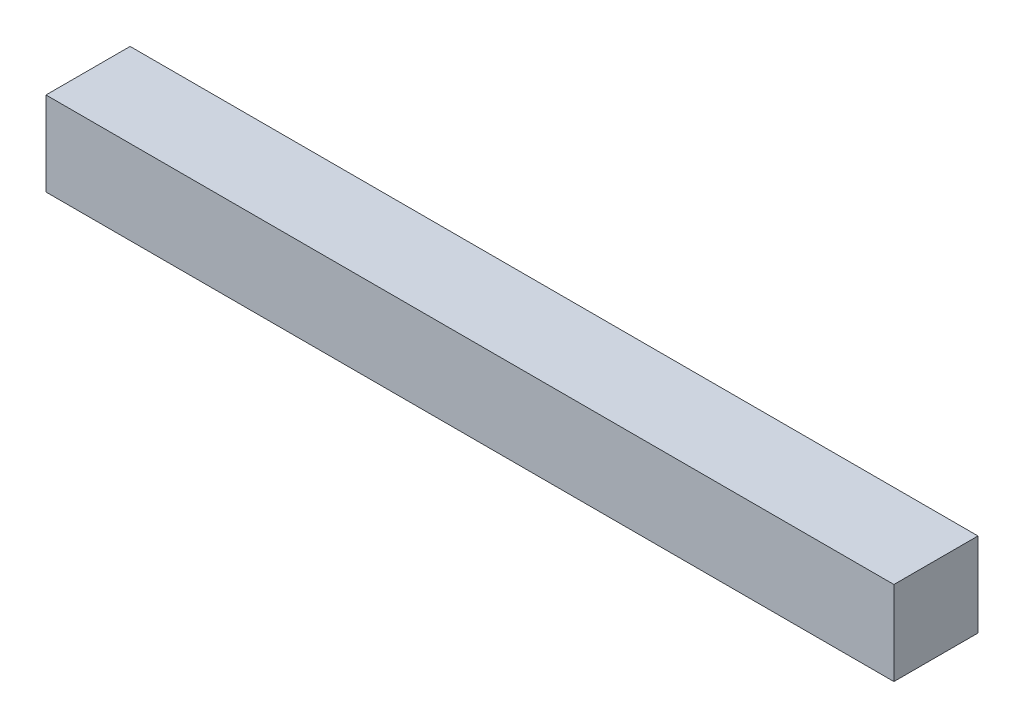
ISO-10303-21;
HEADER;
FILE_DESCRIPTION(('STEP AP214'),'2;1');
FILE_NAME('part.step','',(''),(''),'','','');
FILE_SCHEMA(('AUTOMOTIVE_DESIGN { 1 0 10303 214 1 1 1 1 }'));
ENDSEC;
DATA;
#1=APPLICATION_CONTEXT('core data for automotive mechanical design processes');
#2=APPLICATION_PROTOCOL_DEFINITION('international standard','automotive_design',2000,#1);
#3=PRODUCT_CONTEXT('',#1,'mechanical');
#4=PRODUCT('Part','Part','',(#3));
#5=PRODUCT_RELATED_PRODUCT_CATEGORY('part','',(#4));
#6=PRODUCT_DEFINITION_FORMATION('','',#4);
#7=PRODUCT_DEFINITION_CONTEXT('part definition',#1,'design');
#8=PRODUCT_DEFINITION('design','',#6,#7);
#9=PRODUCT_DEFINITION_SHAPE('','',#8);
#10=(LENGTH_UNIT() NAMED_UNIT(*) SI_UNIT(.MILLI.,.METRE.));
#11=(NAMED_UNIT(*) PLANE_ANGLE_UNIT() SI_UNIT($,.RADIAN.));
#12=(NAMED_UNIT(*) SI_UNIT($,.STERADIAN.) SOLID_ANGLE_UNIT());
#13=UNCERTAINTY_MEASURE_WITH_UNIT(LENGTH_MEASURE(1.E-05),#10,'distance_accuracy_value','');
#14=(GEOMETRIC_REPRESENTATION_CONTEXT(3) GLOBAL_UNCERTAINTY_ASSIGNED_CONTEXT((#13)) GLOBAL_UNIT_ASSIGNED_CONTEXT((#10,
#11,#12)) REPRESENTATION_CONTEXT('',''));
#15=CARTESIAN_POINT('',(0.,0.,0.));
#16=DIRECTION('',(0.,0.,1.));
#17=DIRECTION('',(1.,0.,0.));
#18=AXIS2_PLACEMENT_3D('',#15,#16,#17);
#19=CARTESIAN_POINT('',(-1.,0.4,0.4));
#20=DIRECTION('',(0.,0.,-1.));
#21=DIRECTION('',(0.,1.,0.));
#22=AXIS2_PLACEMENT_3D('',#19,#20,#21);
#23=PLANE('',#22);
#24=DIRECTION('',(0.,-1.,0.));
#25=VECTOR('',#24,1.);
#26=CARTESIAN_POINT('',(-1.033742545802,0.4,0.4));
#27=LINE('',#26,#25);
#28=CARTESIAN_POINT('',(-1.033742545802,0.4,0.4));
#29=VERTEX_POINT('',#28);
#30=CARTESIAN_POINT('',(-1.033742545802,-0.4,0.4));
#31=VERTEX_POINT('',#30);
#32=EDGE_CURVE('E69',#29,#31,#27,.T.);
#33=ORIENTED_EDGE('',*,*,#32,.F.);
#34=DIRECTION('',(-1.,0.,0.));
#35=VECTOR('',#34,1.);
#36=CARTESIAN_POINT('',(-1.,0.4,0.4));
#37=LINE('',#36,#35);
#38=CARTESIAN_POINT('',(-9.1,0.4,0.4));
#39=VERTEX_POINT('',#38);
#40=EDGE_CURVE('E39',#29,#39,#37,.T.);
#41=ORIENTED_EDGE('',*,*,#40,.T.);
#42=DIRECTION('',(0.,-1.,0.));
#43=VECTOR('',#42,1.);
#44=CARTESIAN_POINT('',(-9.1,-0.4,0.4));
#45=LINE('',#44,#43);
#46=CARTESIAN_POINT('',(-9.1,-0.4,0.4));
#47=VERTEX_POINT('',#46);
#48=EDGE_CURVE('E25',#39,#47,#45,.T.);
#49=ORIENTED_EDGE('',*,*,#48,.T.);
#50=DIRECTION('',(-1.,0.,0.));
#51=VECTOR('',#50,1.);
#52=CARTESIAN_POINT('',(-1.,-0.4,0.4));
#53=LINE('',#52,#51);
#54=EDGE_CURVE('E74',#31,#47,#53,.T.);
#55=ORIENTED_EDGE('',*,*,#54,.F.);
#56=EDGE_LOOP('',(#33,#41,#49,#55));
#57=FACE_BOUND('',#56,.T.);
#58=ADVANCED_FACE('F17',(#57),#23,.F.);
#59=CARTESIAN_POINT('',(-1.,-0.4,-0.4));
#60=DIRECTION('',(0.,1.,0.));
#61=DIRECTION('',(0.,0.,1.));
#62=AXIS2_PLACEMENT_3D('',#59,#60,#61);
#63=PLANE('',#62);
#64=DIRECTION('',(0.,0.,-1.));
#65=VECTOR('',#64,1.);
#66=CARTESIAN_POINT('',(-1.03374254580199,-0.4,-0.4));
#67=LINE('',#66,#65);
#68=CARTESIAN_POINT('',(-1.03374254580199,-0.4,-0.4));
#69=VERTEX_POINT('',#68);
#70=EDGE_CURVE('E76',#31,#69,#67,.T.);
#71=ORIENTED_EDGE('',*,*,#70,.F.);
#72=ORIENTED_EDGE('',*,*,#54,.T.);
#73=DIRECTION('',(0.,0.,-1.));
#74=VECTOR('',#73,1.);
#75=CARTESIAN_POINT('',(-9.1,-0.4,-0.4));
#76=LINE('',#75,#74);
#77=CARTESIAN_POINT('',(-9.1,-0.4,-0.4));
#78=VERTEX_POINT('',#77);
#79=EDGE_CURVE('E93',#47,#78,#76,.T.);
#80=ORIENTED_EDGE('',*,*,#79,.T.);
#81=DIRECTION('',(-1.,0.,0.));
#82=VECTOR('',#81,1.);
#83=CARTESIAN_POINT('',(-1.,-0.4,-0.4));
#84=LINE('',#83,#82);
#85=EDGE_CURVE('E85',#69,#78,#84,.T.);
#86=ORIENTED_EDGE('',*,*,#85,.F.);
#87=EDGE_LOOP('',(#71,#72,#80,#86));
#88=FACE_BOUND('',#87,.T.);
#89=ADVANCED_FACE('F134',(#88),#63,.F.);
#90=CARTESIAN_POINT('',(-1.,0.4,-0.4));
#91=DIRECTION('',(0.,0.,1.));
#92=DIRECTION('',(0.,-1.,0.));
#93=AXIS2_PLACEMENT_3D('',#90,#91,#92);
#94=PLANE('',#93);
#95=DIRECTION('',(0.,1.,0.));
#96=VECTOR('',#95,1.);
#97=CARTESIAN_POINT('',(-1.03374254580199,0.4,-0.4));
#98=LINE('',#97,#96);
#99=CARTESIAN_POINT('',(-1.03374254580199,0.4,-0.4));
#100=VERTEX_POINT('',#99);
#101=EDGE_CURVE('E31',#69,#100,#98,.T.);
#102=ORIENTED_EDGE('',*,*,#101,.F.);
#103=ORIENTED_EDGE('',*,*,#85,.T.);
#104=DIRECTION('',(0.,1.,0.));
#105=VECTOR('',#104,1.);
#106=CARTESIAN_POINT('',(-9.1,0.4,-0.4));
#107=LINE('',#106,#105);
#108=CARTESIAN_POINT('',(-9.1,0.4,-0.4));
#109=VERTEX_POINT('',#108);
#110=EDGE_CURVE('E105',#78,#109,#107,.T.);
#111=ORIENTED_EDGE('',*,*,#110,.T.);
#112=DIRECTION('',(-1.,0.,0.));
#113=VECTOR('',#112,1.);
#114=CARTESIAN_POINT('',(-1.,0.4,-0.4));
#115=LINE('',#114,#113);
#116=EDGE_CURVE('E82',#100,#109,#115,.T.);
#117=ORIENTED_EDGE('',*,*,#116,.F.);
#118=EDGE_LOOP('',(#102,#103,#111,#117));
#119=FACE_BOUND('',#118,.T.);
#120=ADVANCED_FACE('F137',(#119),#94,.F.);
#121=CARTESIAN_POINT('',(-1.,0.4,-0.4));
#122=DIRECTION('',(0.,-1.,0.));
#123=DIRECTION('',(0.,0.,-1.));
#124=AXIS2_PLACEMENT_3D('',#121,#122,#123);
#125=PLANE('',#124);
#126=DIRECTION('',(0.,0.,1.));
#127=VECTOR('',#126,1.);
#128=CARTESIAN_POINT('',(-1.03374254580199,0.4,-0.4));
#129=LINE('',#128,#127);
#130=EDGE_CURVE('E11',#100,#29,#129,.T.);
#131=ORIENTED_EDGE('',*,*,#130,.F.);
#132=ORIENTED_EDGE('',*,*,#116,.T.);
#133=DIRECTION('',(0.,0.,1.));
#134=VECTOR('',#133,1.);
#135=CARTESIAN_POINT('',(-9.1,0.4,0.4));
#136=LINE('',#135,#134);
#137=EDGE_CURVE('E80',#109,#39,#136,.T.);
#138=ORIENTED_EDGE('',*,*,#137,.T.);
#139=ORIENTED_EDGE('',*,*,#40,.F.);
#140=EDGE_LOOP('',(#131,#132,#138,#139));
#141=FACE_BOUND('',#140,.T.);
#142=ADVANCED_FACE('F78',(#141),#125,.F.);
#143=CARTESIAN_POINT('',(-9.3,0.,0.));
#144=DIRECTION('',(-1.,0.,0.));
#145=DIRECTION('',(0.,0.,1.));
#146=AXIS2_PLACEMENT_3D('',#143,#144,#145);
#147=PLANE('',#146);
#148=DIRECTION('',(0.,-1.,0.));
#149=VECTOR('',#148,1.);
#150=CARTESIAN_POINT('',(-9.3,-0.4,-0.200000000000003));
#151=LINE('',#150,#149);
#152=CARTESIAN_POINT('',(-9.3,0.200000000000003,-0.200000000000003));
#153=VERTEX_POINT('',#152);
#154=CARTESIAN_POINT('',(-9.3,-0.200000000000003,-0.200000000000003));
#155=VERTEX_POINT('',#154);
#156=EDGE_CURVE('E100',#153,#155,#151,.T.);
#157=ORIENTED_EDGE('',*,*,#156,.T.);
#158=DIRECTION('',(0.,0.,1.));
#159=VECTOR('',#158,1.);
#160=CARTESIAN_POINT('',(-9.3,-0.200000000000003,0.4));
#161=LINE('',#160,#159);
#162=CARTESIAN_POINT('',(-9.3,-0.200000000000003,0.200000000000003));
#163=VERTEX_POINT('',#162);
#164=EDGE_CURVE('E102',#155,#163,#161,.T.);
#165=ORIENTED_EDGE('',*,*,#164,.T.);
#166=DIRECTION('',(0.,1.,0.));
#167=VECTOR('',#166,1.);
#168=CARTESIAN_POINT('',(-9.3,0.4,0.200000000000003));
#169=LINE('',#168,#167);
#170=CARTESIAN_POINT('',(-9.3,0.200000000000003,0.200000000000003));
#171=VERTEX_POINT('',#170);
#172=EDGE_CURVE('E96',#163,#171,#169,.T.);
#173=ORIENTED_EDGE('',*,*,#172,.T.);
#174=DIRECTION('',(0.,0.,-1.));
#175=VECTOR('',#174,1.);
#176=CARTESIAN_POINT('',(-9.3,0.200000000000003,-0.4));
#177=LINE('',#176,#175);
#178=EDGE_CURVE('E98',#171,#153,#177,.T.);
#179=ORIENTED_EDGE('',*,*,#178,.T.);
#180=EDGE_LOOP('',(#157,#165,#173,#179));
#181=FACE_BOUND('',#180,.T.);
#182=ADVANCED_FACE('F145',(#181),#147,.T.);
#183=CARTESIAN_POINT('',(-9.1,0.4,-0.4));
#184=DIRECTION('',(-0.707106781186545,0.707106781186551,0.));
#185=DIRECTION('',(0.,0.,-1.));
#186=AXIS2_PLACEMENT_3D('',#183,#184,#185);
#187=PLANE('',#186);
#188=DIRECTION('',(-0.577350269189629,-0.577350269189624,0.577350269189624));
#189=VECTOR('',#188,1.);
#190=CARTESIAN_POINT('',(-9.1,0.4,-0.4));
#191=LINE('',#190,#189);
#192=EDGE_CURVE('E88',#153,#109,#191,.F.);
#193=ORIENTED_EDGE('',*,*,#192,.F.);
#194=ORIENTED_EDGE('',*,*,#178,.F.);
#195=DIRECTION('',(-0.577350269189629,-0.577350269189624,-0.577350269189624));
#196=VECTOR('',#195,1.);
#197=CARTESIAN_POINT('',(-9.1,0.4,0.4));
#198=LINE('',#197,#196);
#199=EDGE_CURVE('E83',#39,#171,#198,.T.);
#200=ORIENTED_EDGE('',*,*,#199,.F.);
#201=ORIENTED_EDGE('',*,*,#137,.F.);
#202=EDGE_LOOP('',(#193,#194,#200,#201));
#203=FACE_BOUND('',#202,.T.);
#204=ADVANCED_FACE('F19',(#203),#187,.T.);
#205=CARTESIAN_POINT('',(-9.1,0.4,0.4));
#206=DIRECTION('',(-0.707106781186545,0.,0.707106781186551));
#207=DIRECTION('',(0.,1.,0.));
#208=AXIS2_PLACEMENT_3D('',#205,#206,#207);
#209=PLANE('',#208);
#210=ORIENTED_EDGE('',*,*,#199,.T.);
#211=ORIENTED_EDGE('',*,*,#172,.F.);
#212=DIRECTION('',(0.577350269189629,-0.577350269189624,0.577350269189624));
#213=VECTOR('',#212,1.);
#214=CARTESIAN_POINT('',(-9.36666666666667,-0.133333333333335,0.133333333333335));
#215=LINE('',#214,#213);
#216=EDGE_CURVE('E112',#47,#163,#215,.F.);
#217=ORIENTED_EDGE('',*,*,#216,.F.);
#218=ORIENTED_EDGE('',*,*,#48,.F.);
#219=EDGE_LOOP('',(#210,#211,#217,#218));
#220=FACE_BOUND('',#219,.T.);
#221=ADVANCED_FACE('F127',(#220),#209,.T.);
#222=CARTESIAN_POINT('',(-9.1,0.4,-0.4));
#223=DIRECTION('',(-0.707106781186545,0.,-0.707106781186551));
#224=DIRECTION('',(0.,-1.,0.));
#225=AXIS2_PLACEMENT_3D('',#222,#223,#224);
#226=PLANE('',#225);
#227=ORIENTED_EDGE('',*,*,#192,.T.);
#228=ORIENTED_EDGE('',*,*,#110,.F.);
#229=DIRECTION('',(-0.577350269189629,0.577350269189624,0.577350269189624));
#230=VECTOR('',#229,1.);
#231=CARTESIAN_POINT('',(-9.36666666666667,-0.133333333333335,-0.133333333333335));
#232=LINE('',#231,#230);
#233=EDGE_CURVE('E75',#155,#78,#232,.F.);
#234=ORIENTED_EDGE('',*,*,#233,.F.);
#235=ORIENTED_EDGE('',*,*,#156,.F.);
#236=EDGE_LOOP('',(#227,#228,#234,#235));
#237=FACE_BOUND('',#236,.T.);
#238=ADVANCED_FACE('F119',(#237),#226,.T.);
#239=CARTESIAN_POINT('',(-9.1,-0.4,-0.4));
#240=DIRECTION('',(-0.707106781186545,-0.707106781186551,0.));
#241=DIRECTION('',(0.,0.,1.));
#242=AXIS2_PLACEMENT_3D('',#239,#240,#241);
#243=PLANE('',#242);
#244=ORIENTED_EDGE('',*,*,#216,.T.);
#245=ORIENTED_EDGE('',*,*,#164,.F.);
#246=ORIENTED_EDGE('',*,*,#233,.T.);
#247=ORIENTED_EDGE('',*,*,#79,.F.);
#248=EDGE_LOOP('',(#244,#245,#246,#247));
#249=FACE_BOUND('',#248,.T.);
#250=ADVANCED_FACE('F131',(#249),#243,.T.);
#251=CARTESIAN_POINT('',(-1.03374254580192,4.19072924566049,-6.69));
#252=DIRECTION('',(1.,0.,0.));
#253=DIRECTION('',(0.,0.,-1.));
#254=AXIS2_PLACEMENT_3D('',#251,#252,#253);
#255=PLANE('',#254);
#256=ORIENTED_EDGE('',*,*,#32,.T.);
#257=ORIENTED_EDGE('',*,*,#70,.T.);
#258=ORIENTED_EDGE('',*,*,#101,.T.);
#259=ORIENTED_EDGE('',*,*,#130,.T.);
#260=EDGE_LOOP('',(#256,#257,#258,#259));
#261=FACE_BOUND('',#260,.T.);
#262=ADVANCED_FACE('F68',(#261),#255,.T.);
#263=CLOSED_SHELL('',(#58,#89,#120,#142,#182,#204,#221,#238,#250,#262));
#264=MANIFOLD_SOLID_BREP('B1',#263);
#265=ADVANCED_BREP_SHAPE_REPRESENTATION('',(#18,#264),#14);
#266=SHAPE_DEFINITION_REPRESENTATION(#9,#265);
ENDSEC;
END-ISO-10303-21;
